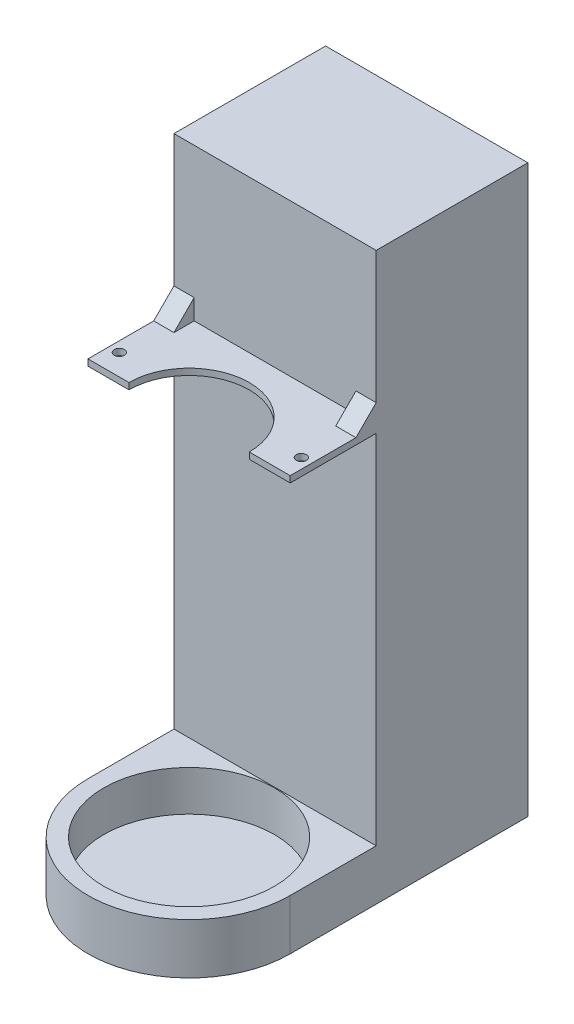
ISO-10303-21;
HEADER;
FILE_DESCRIPTION(('STEP AP214'),'2;1');
FILE_NAME('part.step','',(''),(''),'','','');
FILE_SCHEMA(('AUTOMOTIVE_DESIGN { 1 0 10303 214 1 1 1 1 }'));
ENDSEC;
DATA;
#1=APPLICATION_CONTEXT('core data for automotive mechanical design processes');
#2=APPLICATION_PROTOCOL_DEFINITION('international standard','automotive_design',2000,#1);
#3=PRODUCT_CONTEXT('',#1,'mechanical');
#4=PRODUCT('Part','Part','',(#3));
#5=PRODUCT_RELATED_PRODUCT_CATEGORY('part','',(#4));
#6=PRODUCT_DEFINITION_FORMATION('','',#4);
#7=PRODUCT_DEFINITION_CONTEXT('part definition',#1,'design');
#8=PRODUCT_DEFINITION('design','',#6,#7);
#9=PRODUCT_DEFINITION_SHAPE('','',#8);
#10=(LENGTH_UNIT() NAMED_UNIT(*) SI_UNIT(.MILLI.,.METRE.));
#11=(NAMED_UNIT(*) PLANE_ANGLE_UNIT() SI_UNIT($,.RADIAN.));
#12=(NAMED_UNIT(*) SI_UNIT($,.STERADIAN.) SOLID_ANGLE_UNIT());
#13=UNCERTAINTY_MEASURE_WITH_UNIT(LENGTH_MEASURE(1.E-05),#10,'distance_accuracy_value','');
#14=(GEOMETRIC_REPRESENTATION_CONTEXT(3) GLOBAL_UNCERTAINTY_ASSIGNED_CONTEXT((#13)) GLOBAL_UNIT_ASSIGNED_CONTEXT((#10,
#11,#12)) REPRESENTATION_CONTEXT('',''));
#15=CARTESIAN_POINT('',(0.,0.,0.));
#16=DIRECTION('',(0.,0.,1.));
#17=DIRECTION('',(1.,0.,0.));
#18=AXIS2_PLACEMENT_3D('',#15,#16,#17);
#19=CARTESIAN_POINT('',(0.,0.,38.1));
#20=DIRECTION('',(0.,0.,-1.));
#21=DIRECTION('',(-1.,0.,0.));
#22=AXIS2_PLACEMENT_3D('',#19,#20,#21);
#23=PLANE('',#22);
#24=DIRECTION('',(-1.,0.,0.));
#25=VECTOR('',#24,1.);
#26=CARTESIAN_POINT('',(-20.32,37.986913999,38.1));
#27=LINE('',#26,#25);
#28=CARTESIAN_POINT('',(-20.32,37.986913999,38.1));
#29=VERTEX_POINT('',#28);
#30=CARTESIAN_POINT('',(-25.4,37.986913999,38.1));
#31=VERTEX_POINT('',#30);
#32=EDGE_CURVE('E61',#29,#31,#27,.T.);
#33=ORIENTED_EDGE('',*,*,#32,.F.);
#34=DIRECTION('',(0.,1.,0.));
#35=VECTOR('',#34,1.);
#36=CARTESIAN_POINT('',(-20.32,32.906913999,38.1));
#37=LINE('',#36,#35);
#38=CARTESIAN_POINT('',(-20.32,32.906913999,38.1));
#39=VERTEX_POINT('',#38);
#40=EDGE_CURVE('E178',#39,#29,#37,.T.);
#41=ORIENTED_EDGE('',*,*,#40,.F.);
#42=DIRECTION('',(-1.,0.,0.));
#43=VECTOR('',#42,1.);
#44=CARTESIAN_POINT('',(-25.4,32.906913999,38.1));
#45=LINE('',#44,#43);
#46=CARTESIAN_POINT('',(20.32,32.906913999,38.1));
#47=VERTEX_POINT('',#46);
#48=EDGE_CURVE('E167',#47,#39,#45,.T.);
#49=ORIENTED_EDGE('',*,*,#48,.F.);
#50=DIRECTION('',(0.,1.,0.));
#51=VECTOR('',#50,1.);
#52=CARTESIAN_POINT('',(20.32,32.906913999,38.1));
#53=LINE('',#52,#51);
#54=CARTESIAN_POINT('',(20.32,37.986913999,38.1));
#55=VERTEX_POINT('',#54);
#56=EDGE_CURVE('E191',#47,#55,#53,.T.);
#57=ORIENTED_EDGE('',*,*,#56,.T.);
#58=DIRECTION('',(1.,0.,0.));
#59=VECTOR('',#58,1.);
#60=CARTESIAN_POINT('',(20.32,37.986913999,38.1));
#61=LINE('',#60,#59);
#62=CARTESIAN_POINT('',(25.4,37.986913999,38.1));
#63=VERTEX_POINT('',#62);
#64=EDGE_CURVE('E196',#55,#63,#61,.T.);
#65=ORIENTED_EDGE('',*,*,#64,.T.);
#66=DIRECTION('',(0.,1.,0.));
#67=VECTOR('',#66,1.);
#68=CARTESIAN_POINT('',(25.4,-71.12,38.1));
#69=LINE('',#68,#67);
#70=CARTESIAN_POINT('',(25.4,71.12,38.1));
#71=VERTEX_POINT('',#70);
#72=EDGE_CURVE('E274',#63,#71,#69,.T.);
#73=ORIENTED_EDGE('',*,*,#72,.T.);
#74=DIRECTION('',(-1.,0.,0.));
#75=VECTOR('',#74,1.);
#76=CARTESIAN_POINT('',(-25.4,71.12,38.1));
#77=LINE('',#76,#75);
#78=CARTESIAN_POINT('',(-25.4,71.12,38.1));
#79=VERTEX_POINT('',#78);
#80=EDGE_CURVE('E273',#71,#79,#77,.T.);
#81=ORIENTED_EDGE('',*,*,#80,.T.);
#82=DIRECTION('',(0.,-1.,0.));
#83=VECTOR('',#82,1.);
#84=CARTESIAN_POINT('',(-25.4,-71.12,38.1));
#85=LINE('',#84,#83);
#86=EDGE_CURVE('E66',#79,#31,#85,.T.);
#87=ORIENTED_EDGE('',*,*,#86,.T.);
#88=EDGE_LOOP('',(#33,#41,#49,#57,#65,#73,#81,#87));
#89=FACE_BOUND('',#88,.T.);
#90=ADVANCED_FACE('F45',(#89),#23,.F.);
#91=CARTESIAN_POINT('',(0.,32.906913999,59.69));
#92=DIRECTION('',(0.,1.,0.));
#93=DIRECTION('',(0.,0.,1.));
#94=AXIS2_PLACEMENT_3D('',#91,#92,#93);
#95=PLANE('',#94);
#96=CARTESIAN_POINT('',(22.86,32.906913999,54.3560000000002));
#97=DIRECTION('',(0.,-1.,0.));
#98=DIRECTION('',(0.,0.,1.));
#99=AXIS2_PLACEMENT_3D('',#96,#97,#98);
#100=CIRCLE('',#99,1.27);
#101=CARTESIAN_POINT('',(22.86,32.906913999,55.6260000000002));
#102=VERTEX_POINT('',#101);
#103=EDGE_CURVE('E202',#102,#102,#100,.T.);
#104=ORIENTED_EDGE('',*,*,#103,.T.);
#105=EDGE_LOOP('',(#104));
#106=FACE_BOUND('',#105,.T.);
#107=CARTESIAN_POINT('',(-22.86,32.906913999,54.3560000000002));
#108=DIRECTION('',(0.,1.,0.));
#109=DIRECTION('',(0.,0.,1.));
#110=AXIS2_PLACEMENT_3D('',#107,#108,#109);
#111=CIRCLE('',#110,1.27);
#112=CARTESIAN_POINT('',(-22.86,32.906913999,55.6260000000002));
#113=VERTEX_POINT('',#112);
#114=EDGE_CURVE('E209',#113,#113,#111,.T.);
#115=ORIENTED_EDGE('',*,*,#114,.F.);
#116=EDGE_LOOP('',(#115));
#117=FACE_BOUND('',#116,.T.);
#118=DIRECTION('',(0.,0.,-1.));
#119=VECTOR('',#118,1.);
#120=CARTESIAN_POINT('',(-20.32,32.906913999,43.18));
#121=LINE('',#120,#119);
#122=CARTESIAN_POINT('',(-20.32,32.906913999,43.18));
#123=VERTEX_POINT('',#122);
#124=EDGE_CURVE('E174',#123,#39,#121,.T.);
#125=ORIENTED_EDGE('',*,*,#124,.F.);
#126=DIRECTION('',(-1.,0.,0.));
#127=VECTOR('',#126,1.);
#128=CARTESIAN_POINT('',(-20.32,32.906913999,43.18));
#129=LINE('',#128,#127);
#130=CARTESIAN_POINT('',(-25.4,32.906913999,43.18));
#131=VERTEX_POINT('',#130);
#132=EDGE_CURVE('E170',#123,#131,#129,.T.);
#133=ORIENTED_EDGE('',*,*,#132,.T.);
#134=DIRECTION('',(0.,0.,1.));
#135=VECTOR('',#134,1.);
#136=CARTESIAN_POINT('',(-25.4,32.906913999,59.6900000000002));
#137=LINE('',#136,#135);
#138=CARTESIAN_POINT('',(-25.4,32.906913999,59.6900000000002));
#139=VERTEX_POINT('',#138);
#140=EDGE_CURVE('E157',#131,#139,#137,.T.);
#141=ORIENTED_EDGE('',*,*,#140,.T.);
#142=DIRECTION('',(1.,0.,0.));
#143=VECTOR('',#142,1.);
#144=CARTESIAN_POINT('',(-15.113,32.906913999,59.69));
#145=LINE('',#144,#143);
#146=CARTESIAN_POINT('',(-15.113,32.906913999,59.69));
#147=VERTEX_POINT('',#146);
#148=EDGE_CURVE('E166',#139,#147,#145,.T.);
#149=ORIENTED_EDGE('',*,*,#148,.T.);
#150=CARTESIAN_POINT('',(0.,32.906913999,59.69));
#151=DIRECTION('',(0.,-1.,0.));
#152=DIRECTION('',(0.,0.,1.));
#153=AXIS2_PLACEMENT_3D('',#150,#151,#152);
#154=CIRCLE('',#153,15.113);
#155=CARTESIAN_POINT('',(15.113,32.906913999,59.69));
#156=VERTEX_POINT('',#155);
#157=EDGE_CURVE('E216',#147,#156,#154,.T.);
#158=ORIENTED_EDGE('',*,*,#157,.T.);
#159=DIRECTION('',(1.,0.,0.));
#160=VECTOR('',#159,1.);
#161=CARTESIAN_POINT('',(25.4,32.906913999,59.69));
#162=LINE('',#161,#160);
#163=CARTESIAN_POINT('',(25.4,32.906913999,59.69));
#164=VERTEX_POINT('',#163);
#165=EDGE_CURVE('E219',#156,#164,#162,.T.);
#166=ORIENTED_EDGE('',*,*,#165,.T.);
#167=DIRECTION('',(0.,0.,-1.));
#168=VECTOR('',#167,1.);
#169=CARTESIAN_POINT('',(25.4,32.906913999,38.1));
#170=LINE('',#169,#168);
#171=CARTESIAN_POINT('',(25.4,32.906913999,43.18));
#172=VERTEX_POINT('',#171);
#173=EDGE_CURVE('E222',#164,#172,#170,.T.);
#174=ORIENTED_EDGE('',*,*,#173,.T.);
#175=DIRECTION('',(1.,0.,0.));
#176=VECTOR('',#175,1.);
#177=CARTESIAN_POINT('',(20.32,32.906913999,43.18));
#178=LINE('',#177,#176);
#179=CARTESIAN_POINT('',(20.32,32.906913999,43.18));
#180=VERTEX_POINT('',#179);
#181=EDGE_CURVE('E199',#180,#172,#178,.T.);
#182=ORIENTED_EDGE('',*,*,#181,.F.);
#183=DIRECTION('',(0.,0.,-1.));
#184=VECTOR('',#183,1.);
#185=CARTESIAN_POINT('',(20.32,32.906913999,43.18));
#186=LINE('',#185,#184);
#187=EDGE_CURVE('E189',#180,#47,#186,.T.);
#188=ORIENTED_EDGE('',*,*,#187,.T.);
#189=ORIENTED_EDGE('',*,*,#48,.T.);
#190=EDGE_LOOP('',(#125,#133,#141,#149,#158,#166,#174,#182,#188,#189));
#191=FACE_BOUND('',#190,.T.);
#192=ADVANCED_FACE('F171',(#106,#117,#191),#95,.T.);
#193=DIRECTION('',(-1.,0.,0.));
#194=VECTOR('',#193,1.);
#195=CARTESIAN_POINT('',(-25.4,31.309796869,38.1));
#196=LINE('',#195,#194);
#197=CARTESIAN_POINT('',(25.4,31.309796869,38.1));
#198=VERTEX_POINT('',#197);
#199=CARTESIAN_POINT('',(-25.4,31.309796869,38.1));
#200=VERTEX_POINT('',#199);
#201=EDGE_CURVE('E234',#198,#200,#196,.T.);
#202=ORIENTED_EDGE('',*,*,#201,.T.);
#203=CARTESIAN_POINT('',(-25.4,-58.42,38.1));
#204=VERTEX_POINT('',#203);
#205=EDGE_CURVE('E276',#200,#204,#85,.T.);
#206=ORIENTED_EDGE('',*,*,#205,.T.);
#207=DIRECTION('',(-1.,0.,0.));
#208=VECTOR('',#207,1.);
#209=CARTESIAN_POINT('',(0.,-58.42,38.1));
#210=LINE('',#209,#208);
#211=CARTESIAN_POINT('',(25.4,-58.42,38.1));
#212=VERTEX_POINT('',#211);
#213=EDGE_CURVE('E261',#212,#204,#210,.T.);
#214=ORIENTED_EDGE('',*,*,#213,.F.);
#215=EDGE_CURVE('E271',#212,#198,#69,.T.);
#216=ORIENTED_EDGE('',*,*,#215,.T.);
#217=EDGE_LOOP('',(#202,#206,#214,#216));
#218=FACE_BOUND('',#217,.T.);
#219=ADVANCED_FACE('F323',(#218),#23,.F.);
#220=CARTESIAN_POINT('',(0.,-58.42,59.69));
#221=DIRECTION('',(0.,-1.,0.));
#222=DIRECTION('',(0.,0.,-1.));
#223=AXIS2_PLACEMENT_3D('',#220,#221,#222);
#224=CYLINDRICAL_SURFACE('',#223,21.43125);
#225=CARTESIAN_POINT('',(0.,-58.42,59.69));
#226=DIRECTION('',(0.,-1.,0.));
#227=DIRECTION('',(0.,0.,-1.));
#228=AXIS2_PLACEMENT_3D('',#225,#226,#227);
#229=CIRCLE('',#228,21.43125);
#230=CARTESIAN_POINT('',(0.,-58.42,38.25875));
#231=VERTEX_POINT('',#230);
#232=EDGE_CURVE('E250',#231,#231,#229,.T.);
#233=ORIENTED_EDGE('',*,*,#232,.F.);
#234=EDGE_LOOP('',(#233));
#235=FACE_BOUND('',#234,.T.);
#236=CARTESIAN_POINT('',(0.,-68.58,59.69));
#237=DIRECTION('',(0.,-1.,0.));
#238=DIRECTION('',(0.,0.,-1.));
#239=AXIS2_PLACEMENT_3D('',#236,#237,#238);
#240=CIRCLE('',#239,21.43125);
#241=CARTESIAN_POINT('',(0.,-68.58,38.25875));
#242=VERTEX_POINT('',#241);
#243=EDGE_CURVE('E11',#242,#242,#240,.F.);
#244=ORIENTED_EDGE('',*,*,#243,.F.);
#245=EDGE_LOOP('',(#244));
#246=FACE_BOUND('',#245,.T.);
#247=ADVANCED_FACE('F368',(#235,#246),#224,.F.);
#248=CARTESIAN_POINT('',(25.4,-71.12,38.1));
#249=DIRECTION('',(-1.,0.,0.));
#250=DIRECTION('',(0.,0.,1.));
#251=AXIS2_PLACEMENT_3D('',#248,#249,#250);
#252=PLANE('',#251);
#253=ORIENTED_EDGE('',*,*,#72,.F.);
#254=DIRECTION('',(0.,-0.707106781186548,0.707106781186548));
#255=VECTOR('',#254,1.);
#256=CARTESIAN_POINT('',(25.4,37.986913999,38.1));
#257=LINE('',#256,#255);
#258=EDGE_CURVE('E187',#63,#172,#257,.T.);
#259=ORIENTED_EDGE('',*,*,#258,.T.);
#260=ORIENTED_EDGE('',*,*,#173,.F.);
#261=DIRECTION('',(0.,-1.,0.));
#262=VECTOR('',#261,1.);
#263=CARTESIAN_POINT('',(25.4,32.906913999,59.69));
#264=LINE('',#263,#262);
#265=CARTESIAN_POINT('',(25.4,31.309796869,59.69));
#266=VERTEX_POINT('',#265);
#267=EDGE_CURVE('E243',#164,#266,#264,.T.);
#268=ORIENTED_EDGE('',*,*,#267,.T.);
#269=DIRECTION('',(0.,0.,-1.));
#270=VECTOR('',#269,1.);
#271=CARTESIAN_POINT('',(25.4,31.309796869,38.1));
#272=LINE('',#271,#270);
#273=EDGE_CURVE('E231',#266,#198,#272,.T.);
#274=ORIENTED_EDGE('',*,*,#273,.T.);
#275=ORIENTED_EDGE('',*,*,#215,.F.);
#276=DIRECTION('',(0.,0.,1.));
#277=VECTOR('',#276,1.);
#278=CARTESIAN_POINT('',(25.4,-58.42,0.));
#279=LINE('',#278,#277);
#280=CARTESIAN_POINT('',(25.4,-58.42,59.69));
#281=VERTEX_POINT('',#280);
#282=EDGE_CURVE('E253',#212,#281,#279,.T.);
#283=ORIENTED_EDGE('',*,*,#282,.T.);
#284=DIRECTION('',(0.,-1.,0.));
#285=VECTOR('',#284,1.);
#286=CARTESIAN_POINT('',(25.4,-58.42,59.69));
#287=LINE('',#286,#285);
#288=CARTESIAN_POINT('',(25.4,-71.12,59.69));
#289=VERTEX_POINT('',#288);
#290=EDGE_CURVE('E264',#281,#289,#287,.T.);
#291=ORIENTED_EDGE('',*,*,#290,.T.);
#292=DIRECTION('',(0.,0.,-1.));
#293=VECTOR('',#292,1.);
#294=CARTESIAN_POINT('',(25.4,-71.12,38.1));
#295=LINE('',#294,#293);
#296=CARTESIAN_POINT('',(25.4,-71.12,0.));
#297=VERTEX_POINT('',#296);
#298=EDGE_CURVE('E278',#289,#297,#295,.T.);
#299=ORIENTED_EDGE('',*,*,#298,.T.);
#300=DIRECTION('',(0.,1.,0.));
#301=VECTOR('',#300,1.);
#302=CARTESIAN_POINT('',(25.4,-71.12,0.));
#303=LINE('',#302,#301);
#304=CARTESIAN_POINT('',(25.4,71.12,0.));
#305=VERTEX_POINT('',#304);
#306=EDGE_CURVE('E269',#297,#305,#303,.T.);
#307=ORIENTED_EDGE('',*,*,#306,.T.);
#308=DIRECTION('',(0.,0.,-1.));
#309=VECTOR('',#308,1.);
#310=CARTESIAN_POINT('',(25.4,71.12,38.1));
#311=LINE('',#310,#309);
#312=EDGE_CURVE('E49',#71,#305,#311,.T.);
#313=ORIENTED_EDGE('',*,*,#312,.F.);
#314=EDGE_LOOP('',(#253,#259,#260,#268,#274,#275,#283,#291,#299,#307,#313));
#315=FACE_BOUND('',#314,.T.);
#316=ADVANCED_FACE('F47',(#315),#252,.F.);
#317=CARTESIAN_POINT('',(-25.4,71.12,38.1));
#318=DIRECTION('',(0.,-1.,0.));
#319=DIRECTION('',(0.,0.,-1.));
#320=AXIS2_PLACEMENT_3D('',#317,#318,#319);
#321=PLANE('',#320);
#322=DIRECTION('',(-1.,0.,0.));
#323=VECTOR('',#322,1.);
#324=CARTESIAN_POINT('',(-25.4,71.12,0.));
#325=LINE('',#324,#323);
#326=CARTESIAN_POINT('',(-25.4,71.12,0.));
#327=VERTEX_POINT('',#326);
#328=EDGE_CURVE('E281',#305,#327,#325,.T.);
#329=ORIENTED_EDGE('',*,*,#328,.T.);
#330=DIRECTION('',(0.,0.,-1.));
#331=VECTOR('',#330,1.);
#332=CARTESIAN_POINT('',(-25.4,71.12,38.1));
#333=LINE('',#332,#331);
#334=EDGE_CURVE('E291',#79,#327,#333,.T.);
#335=ORIENTED_EDGE('',*,*,#334,.F.);
#336=ORIENTED_EDGE('',*,*,#80,.F.);
#337=ORIENTED_EDGE('',*,*,#312,.T.);
#338=EDGE_LOOP('',(#329,#335,#336,#337));
#339=FACE_BOUND('',#338,.T.);
#340=ADVANCED_FACE('F299',(#339),#321,.F.);
#341=CARTESIAN_POINT('',(-25.4,-71.12,38.1));
#342=DIRECTION('',(1.,0.,0.));
#343=DIRECTION('',(0.,0.,-1.));
#344=AXIS2_PLACEMENT_3D('',#341,#342,#343);
#345=PLANE('',#344);
#346=DIRECTION('',(0.,-0.707106781186548,0.707106781186548));
#347=VECTOR('',#346,1.);
#348=CARTESIAN_POINT('',(-25.4,37.986913999,38.1));
#349=LINE('',#348,#347);
#350=EDGE_CURVE('E161',#31,#131,#349,.T.);
#351=ORIENTED_EDGE('',*,*,#350,.F.);
#352=ORIENTED_EDGE('',*,*,#86,.F.);
#353=ORIENTED_EDGE('',*,*,#334,.T.);
#354=DIRECTION('',(0.,-1.,0.));
#355=VECTOR('',#354,1.);
#356=CARTESIAN_POINT('',(-25.4,-71.12,0.));
#357=LINE('',#356,#355);
#358=CARTESIAN_POINT('',(-25.4,-71.12,0.));
#359=VERTEX_POINT('',#358);
#360=EDGE_CURVE('E283',#327,#359,#357,.T.);
#361=ORIENTED_EDGE('',*,*,#360,.T.);
#362=DIRECTION('',(0.,0.,-1.));
#363=VECTOR('',#362,1.);
#364=CARTESIAN_POINT('',(-25.4,-71.12,38.1));
#365=LINE('',#364,#363);
#366=CARTESIAN_POINT('',(-25.4,-71.12,59.69));
#367=VERTEX_POINT('',#366);
#368=EDGE_CURVE('E290',#367,#359,#365,.T.);
#369=ORIENTED_EDGE('',*,*,#368,.F.);
#370=DIRECTION('',(0.,-1.,0.));
#371=VECTOR('',#370,1.);
#372=CARTESIAN_POINT('',(-25.4,-58.42,59.69));
#373=LINE('',#372,#371);
#374=CARTESIAN_POINT('',(-25.4,-58.42,59.69));
#375=VERTEX_POINT('',#374);
#376=EDGE_CURVE('E267',#375,#367,#373,.T.);
#377=ORIENTED_EDGE('',*,*,#376,.F.);
#378=DIRECTION('',(0.,0.,1.));
#379=VECTOR('',#378,1.);
#380=CARTESIAN_POINT('',(-25.4,-58.42,0.));
#381=LINE('',#380,#379);
#382=EDGE_CURVE('E259',#204,#375,#381,.T.);
#383=ORIENTED_EDGE('',*,*,#382,.F.);
#384=ORIENTED_EDGE('',*,*,#205,.F.);
#385=DIRECTION('',(0.,0.,1.));
#386=VECTOR('',#385,1.);
#387=CARTESIAN_POINT('',(-25.4,31.309796869,59.6900000000002));
#388=LINE('',#387,#386);
#389=CARTESIAN_POINT('',(-25.4,31.309796869,59.6900000000002));
#390=VERTEX_POINT('',#389);
#391=EDGE_CURVE('E237',#200,#390,#388,.T.);
#392=ORIENTED_EDGE('',*,*,#391,.T.);
#393=DIRECTION('',(0.,-1.,0.));
#394=VECTOR('',#393,1.);
#395=CARTESIAN_POINT('',(-25.4,32.906913999,59.6900000000002));
#396=LINE('',#395,#394);
#397=EDGE_CURVE('E163',#139,#390,#396,.T.);
#398=ORIENTED_EDGE('',*,*,#397,.F.);
#399=ORIENTED_EDGE('',*,*,#140,.F.);
#400=EDGE_LOOP('',(#351,#352,#353,#361,#369,#377,#383,#384,#392,#398,#399));
#401=FACE_BOUND('',#400,.T.);
#402=ADVANCED_FACE('F159',(#401),#345,.F.);
#403=CARTESIAN_POINT('',(-25.4,-71.12,38.1));
#404=DIRECTION('',(0.,1.,0.));
#405=DIRECTION('',(0.,0.,1.));
#406=AXIS2_PLACEMENT_3D('',#403,#404,#405);
#407=PLANE('',#406);
#408=ORIENTED_EDGE('',*,*,#368,.T.);
#409=DIRECTION('',(1.,0.,0.));
#410=VECTOR('',#409,1.);
#411=CARTESIAN_POINT('',(-25.4,-71.12,0.));
#412=LINE('',#411,#410);
#413=EDGE_CURVE('E286',#359,#297,#412,.T.);
#414=ORIENTED_EDGE('',*,*,#413,.T.);
#415=ORIENTED_EDGE('',*,*,#298,.F.);
#416=CARTESIAN_POINT('',(0.,-71.12,59.69));
#417=DIRECTION('',(0.,-1.,0.));
#418=DIRECTION('',(0.,0.,-1.));
#419=AXIS2_PLACEMENT_3D('',#416,#417,#418);
#420=CIRCLE('',#419,25.4);
#421=EDGE_CURVE('E248',#289,#367,#420,.T.);
#422=ORIENTED_EDGE('',*,*,#421,.T.);
#423=EDGE_LOOP('',(#408,#414,#415,#422));
#424=FACE_BOUND('',#423,.T.);
#425=ADVANCED_FACE('F312',(#424),#407,.F.);
#426=CARTESIAN_POINT('',(0.,0.,0.));
#427=DIRECTION('',(0.,0.,-1.));
#428=DIRECTION('',(-1.,0.,0.));
#429=AXIS2_PLACEMENT_3D('',#426,#427,#428);
#430=PLANE('',#429);
#431=ORIENTED_EDGE('',*,*,#306,.F.);
#432=ORIENTED_EDGE('',*,*,#413,.F.);
#433=ORIENTED_EDGE('',*,*,#360,.F.);
#434=ORIENTED_EDGE('',*,*,#328,.F.);
#435=EDGE_LOOP('',(#431,#432,#433,#434));
#436=FACE_BOUND('',#435,.T.);
#437=ADVANCED_FACE('F306',(#436),#430,.T.);
#438=CARTESIAN_POINT('',(0.,-58.42,59.69));
#439=DIRECTION('',(0.,-1.,0.));
#440=DIRECTION('',(0.,0.,-1.));
#441=AXIS2_PLACEMENT_3D('',#438,#439,#440);
#442=CYLINDRICAL_SURFACE('',#441,25.4);
#443=ORIENTED_EDGE('',*,*,#421,.F.);
#444=ORIENTED_EDGE('',*,*,#290,.F.);
#445=CARTESIAN_POINT('',(0.,-58.42,59.69));
#446=DIRECTION('',(0.,-1.,0.));
#447=DIRECTION('',(0.,0.,-1.));
#448=AXIS2_PLACEMENT_3D('',#445,#446,#447);
#449=CIRCLE('',#448,25.4);
#450=EDGE_CURVE('E256',#281,#375,#449,.T.);
#451=ORIENTED_EDGE('',*,*,#450,.T.);
#452=ORIENTED_EDGE('',*,*,#376,.T.);
#453=EDGE_LOOP('',(#443,#444,#451,#452));
#454=FACE_BOUND('',#453,.T.);
#455=ADVANCED_FACE('F314',(#454),#442,.T.);
#456=CARTESIAN_POINT('',(0.,-58.42,0.));
#457=DIRECTION('',(0.,-1.,0.));
#458=DIRECTION('',(0.,0.,-1.));
#459=AXIS2_PLACEMENT_3D('',#456,#457,#458);
#460=PLANE('',#459);
#461=ORIENTED_EDGE('',*,*,#232,.T.);
#462=EDGE_LOOP('',(#461));
#463=FACE_BOUND('',#462,.T.);
#464=ORIENTED_EDGE('',*,*,#282,.F.);
#465=ORIENTED_EDGE('',*,*,#213,.T.);
#466=ORIENTED_EDGE('',*,*,#382,.T.);
#467=ORIENTED_EDGE('',*,*,#450,.F.);
#468=EDGE_LOOP('',(#464,#465,#466,#467));
#469=FACE_BOUND('',#468,.T.);
#470=ADVANCED_FACE('F318',(#463,#469),#460,.F.);
#471=CARTESIAN_POINT('',(0.,-68.58,0.));
#472=DIRECTION('',(0.,-1.,0.));
#473=DIRECTION('',(0.,0.,-1.));
#474=AXIS2_PLACEMENT_3D('',#471,#472,#473);
#475=PLANE('',#474);
#476=ORIENTED_EDGE('',*,*,#243,.T.);
#477=EDGE_LOOP('',(#476));
#478=FACE_BOUND('',#477,.T.);
#479=ADVANCED_FACE('F383',(#478),#475,.F.);
#480=CARTESIAN_POINT('',(0.,32.906913999,59.69));
#481=DIRECTION('',(0.,-1.,0.));
#482=DIRECTION('',(0.,0.,-1.));
#483=AXIS2_PLACEMENT_3D('',#480,#481,#482);
#484=CYLINDRICAL_SURFACE('',#483,15.113);
#485=CARTESIAN_POINT('',(0.,31.309796869,59.69));
#486=DIRECTION('',(0.,-1.,0.));
#487=DIRECTION('',(0.,0.,1.));
#488=AXIS2_PLACEMENT_3D('',#485,#486,#487);
#489=CIRCLE('',#488,15.113);
#490=CARTESIAN_POINT('',(-15.113,31.309796869,59.69));
#491=VERTEX_POINT('',#490);
#492=CARTESIAN_POINT('',(15.113,31.309796869,59.69));
#493=VERTEX_POINT('',#492);
#494=EDGE_CURVE('E215',#491,#493,#489,.T.);
#495=ORIENTED_EDGE('',*,*,#494,.T.);
#496=DIRECTION('',(0.,-1.,0.));
#497=VECTOR('',#496,1.);
#498=CARTESIAN_POINT('',(15.113,32.906913999,59.69));
#499=LINE('',#498,#497);
#500=EDGE_CURVE('E246',#156,#493,#499,.T.);
#501=ORIENTED_EDGE('',*,*,#500,.F.);
#502=ORIENTED_EDGE('',*,*,#157,.F.);
#503=DIRECTION('',(0.,-1.,0.));
#504=VECTOR('',#503,1.);
#505=CARTESIAN_POINT('',(-15.113,32.906913999,59.69));
#506=LINE('',#505,#504);
#507=EDGE_CURVE('E226',#147,#491,#506,.T.);
#508=ORIENTED_EDGE('',*,*,#507,.T.);
#509=EDGE_LOOP('',(#495,#501,#502,#508));
#510=FACE_BOUND('',#509,.T.);
#511=ADVANCED_FACE('F334',(#510),#484,.F.);
#512=CARTESIAN_POINT('',(25.4,32.906913999,59.69));
#513=DIRECTION('',(0.,0.,-1.));
#514=DIRECTION('',(-1.,0.,0.));
#515=AXIS2_PLACEMENT_3D('',#512,#513,#514);
#516=PLANE('',#515);
#517=DIRECTION('',(1.,0.,0.));
#518=VECTOR('',#517,1.);
#519=CARTESIAN_POINT('',(25.4,31.309796869,59.69));
#520=LINE('',#519,#518);
#521=EDGE_CURVE('E229',#493,#266,#520,.T.);
#522=ORIENTED_EDGE('',*,*,#521,.T.);
#523=ORIENTED_EDGE('',*,*,#267,.F.);
#524=ORIENTED_EDGE('',*,*,#165,.F.);
#525=ORIENTED_EDGE('',*,*,#500,.T.);
#526=EDGE_LOOP('',(#522,#523,#524,#525));
#527=FACE_BOUND('',#526,.T.);
#528=ADVANCED_FACE('F339',(#527),#516,.F.);
#529=CARTESIAN_POINT('',(-15.113,32.906913999,59.69));
#530=DIRECTION('',(0.,0.,-1.));
#531=DIRECTION('',(-1.,0.,0.));
#532=AXIS2_PLACEMENT_3D('',#529,#530,#531);
#533=PLANE('',#532);
#534=DIRECTION('',(1.,0.,0.));
#535=VECTOR('',#534,1.);
#536=CARTESIAN_POINT('',(-15.113,31.309796869,59.69));
#537=LINE('',#536,#535);
#538=EDGE_CURVE('E220',#390,#491,#537,.T.);
#539=ORIENTED_EDGE('',*,*,#538,.T.);
#540=ORIENTED_EDGE('',*,*,#507,.F.);
#541=ORIENTED_EDGE('',*,*,#148,.F.);
#542=ORIENTED_EDGE('',*,*,#397,.T.);
#543=EDGE_LOOP('',(#539,#540,#541,#542));
#544=FACE_BOUND('',#543,.T.);
#545=ADVANCED_FACE('F328',(#544),#533,.F.);
#546=CARTESIAN_POINT('',(0.,31.309796869,59.69));
#547=DIRECTION('',(0.,1.,0.));
#548=DIRECTION('',(0.,0.,1.));
#549=AXIS2_PLACEMENT_3D('',#546,#547,#548);
#550=PLANE('',#549);
#551=CARTESIAN_POINT('',(22.86,31.309796869,54.3560000000002));
#552=DIRECTION('',(0.,1.,0.));
#553=DIRECTION('',(0.,0.,1.));
#554=AXIS2_PLACEMENT_3D('',#551,#552,#553);
#555=CIRCLE('',#554,1.27);
#556=CARTESIAN_POINT('',(22.86,31.309796869,55.6260000000002));
#557=VERTEX_POINT('',#556);
#558=EDGE_CURVE('E206',#557,#557,#555,.T.);
#559=ORIENTED_EDGE('',*,*,#558,.T.);
#560=EDGE_LOOP('',(#559));
#561=FACE_BOUND('',#560,.T.);
#562=CARTESIAN_POINT('',(-22.86,31.309796869,54.3560000000002));
#563=DIRECTION('',(0.,1.,0.));
#564=DIRECTION('',(0.,0.,1.));
#565=AXIS2_PLACEMENT_3D('',#562,#563,#564);
#566=CIRCLE('',#565,1.27);
#567=CARTESIAN_POINT('',(-22.86,31.309796869,55.6260000000002));
#568=VERTEX_POINT('',#567);
#569=EDGE_CURVE('E212',#568,#568,#566,.F.);
#570=ORIENTED_EDGE('',*,*,#569,.F.);
#571=EDGE_LOOP('',(#570));
#572=FACE_BOUND('',#571,.T.);
#573=ORIENTED_EDGE('',*,*,#494,.F.);
#574=ORIENTED_EDGE('',*,*,#538,.F.);
#575=ORIENTED_EDGE('',*,*,#391,.F.);
#576=ORIENTED_EDGE('',*,*,#201,.F.);
#577=ORIENTED_EDGE('',*,*,#273,.F.);
#578=ORIENTED_EDGE('',*,*,#521,.F.);
#579=EDGE_LOOP('',(#573,#574,#575,#576,#577,#578));
#580=FACE_BOUND('',#579,.T.);
#581=ADVANCED_FACE('F331',(#561,#572,#580),#550,.F.);
#582=CARTESIAN_POINT('',(-22.86,27.7176944205723,54.3560000000002));
#583=DIRECTION('',(0.,1.,0.));
#584=DIRECTION('',(0.,0.,1.));
#585=AXIS2_PLACEMENT_3D('',#582,#583,#584);
#586=CYLINDRICAL_SURFACE('',#585,1.27);
#587=ORIENTED_EDGE('',*,*,#569,.T.);
#588=EDGE_LOOP('',(#587));
#589=FACE_BOUND('',#588,.T.);
#590=ORIENTED_EDGE('',*,*,#114,.T.);
#591=EDGE_LOOP('',(#590));
#592=FACE_BOUND('',#591,.T.);
#593=ADVANCED_FACE('F395',(#589,#592),#586,.F.);
#594=CARTESIAN_POINT('',(22.86,27.7176944205723,54.3560000000002));
#595=DIRECTION('',(0.,1.,0.));
#596=DIRECTION('',(0.,0.,1.));
#597=AXIS2_PLACEMENT_3D('',#594,#595,#596);
#598=CYLINDRICAL_SURFACE('',#597,1.27);
#599=ORIENTED_EDGE('',*,*,#558,.F.);
#600=EDGE_LOOP('',(#599));
#601=FACE_BOUND('',#600,.T.);
#602=ORIENTED_EDGE('',*,*,#103,.F.);
#603=EDGE_LOOP('',(#602));
#604=FACE_BOUND('',#603,.T.);
#605=ADVANCED_FACE('F400',(#601,#604),#598,.F.);
#606=CARTESIAN_POINT('',(20.32,37.986913999,38.1));
#607=DIRECTION('',(0.,0.707106781186548,0.707106781186548));
#608=DIRECTION('',(0.,-0.707106781186548,0.707106781186548));
#609=AXIS2_PLACEMENT_3D('',#606,#607,#608);
#610=PLANE('',#609);
#611=ORIENTED_EDGE('',*,*,#258,.F.);
#612=ORIENTED_EDGE('',*,*,#64,.F.);
#613=DIRECTION('',(0.,-0.707106781186548,0.707106781186548));
#614=VECTOR('',#613,1.);
#615=CARTESIAN_POINT('',(20.32,37.986913999,38.1));
#616=LINE('',#615,#614);
#617=EDGE_CURVE('E193',#55,#180,#616,.T.);
#618=ORIENTED_EDGE('',*,*,#617,.T.);
#619=ORIENTED_EDGE('',*,*,#181,.T.);
#620=EDGE_LOOP('',(#611,#612,#618,#619));
#621=FACE_BOUND('',#620,.T.);
#622=ADVANCED_FACE('F343',(#621),#610,.T.);
#623=CARTESIAN_POINT('',(20.32,0.,0.));
#624=DIRECTION('',(1.,0.,0.));
#625=DIRECTION('',(0.,0.,-1.));
#626=AXIS2_PLACEMENT_3D('',#623,#624,#625);
#627=PLANE('',#626);
#628=ORIENTED_EDGE('',*,*,#187,.F.);
#629=ORIENTED_EDGE('',*,*,#617,.F.);
#630=ORIENTED_EDGE('',*,*,#56,.F.);
#631=EDGE_LOOP('',(#628,#629,#630));
#632=FACE_BOUND('',#631,.T.);
#633=ADVANCED_FACE('F349',(#632),#627,.F.);
#634=CARTESIAN_POINT('',(-20.32,37.986913999,38.1));
#635=DIRECTION('',(0.,-0.707106781186548,-0.707106781186548));
#636=DIRECTION('',(0.,0.707106781186548,-0.707106781186548));
#637=AXIS2_PLACEMENT_3D('',#634,#635,#636);
#638=PLANE('',#637);
#639=ORIENTED_EDGE('',*,*,#350,.T.);
#640=ORIENTED_EDGE('',*,*,#132,.F.);
#641=DIRECTION('',(0.,-0.707106781186548,0.707106781186548));
#642=VECTOR('',#641,1.);
#643=CARTESIAN_POINT('',(-20.32,37.986913999,38.1));
#644=LINE('',#643,#642);
#645=EDGE_CURVE('E182',#29,#123,#644,.T.);
#646=ORIENTED_EDGE('',*,*,#645,.F.);
#647=ORIENTED_EDGE('',*,*,#32,.T.);
#648=EDGE_LOOP('',(#639,#640,#646,#647));
#649=FACE_BOUND('',#648,.T.);
#650=ADVANCED_FACE('F180',(#649),#638,.F.);
#651=CARTESIAN_POINT('',(-20.32,0.,0.));
#652=DIRECTION('',(-1.,0.,0.));
#653=DIRECTION('',(0.,0.,-1.));
#654=AXIS2_PLACEMENT_3D('',#651,#652,#653);
#655=PLANE('',#654);
#656=ORIENTED_EDGE('',*,*,#124,.T.);
#657=ORIENTED_EDGE('',*,*,#40,.T.);
#658=ORIENTED_EDGE('',*,*,#645,.T.);
#659=EDGE_LOOP('',(#656,#657,#658));
#660=FACE_BOUND('',#659,.T.);
#661=ADVANCED_FACE('F351',(#660),#655,.F.);
#662=CLOSED_SHELL('',(#90,#192,#219,#247,#316,#340,#402,#425,#437,#455,#470,#479,#511,#528,#545,
#581,#593,#605,#622,#633,#650,#661));
#663=MANIFOLD_SOLID_BREP('B2',#662);
#664=ADVANCED_BREP_SHAPE_REPRESENTATION('',(#18,#663),#14);
#665=SHAPE_DEFINITION_REPRESENTATION(#9,#664);
ENDSEC;
END-ISO-10303-21;
